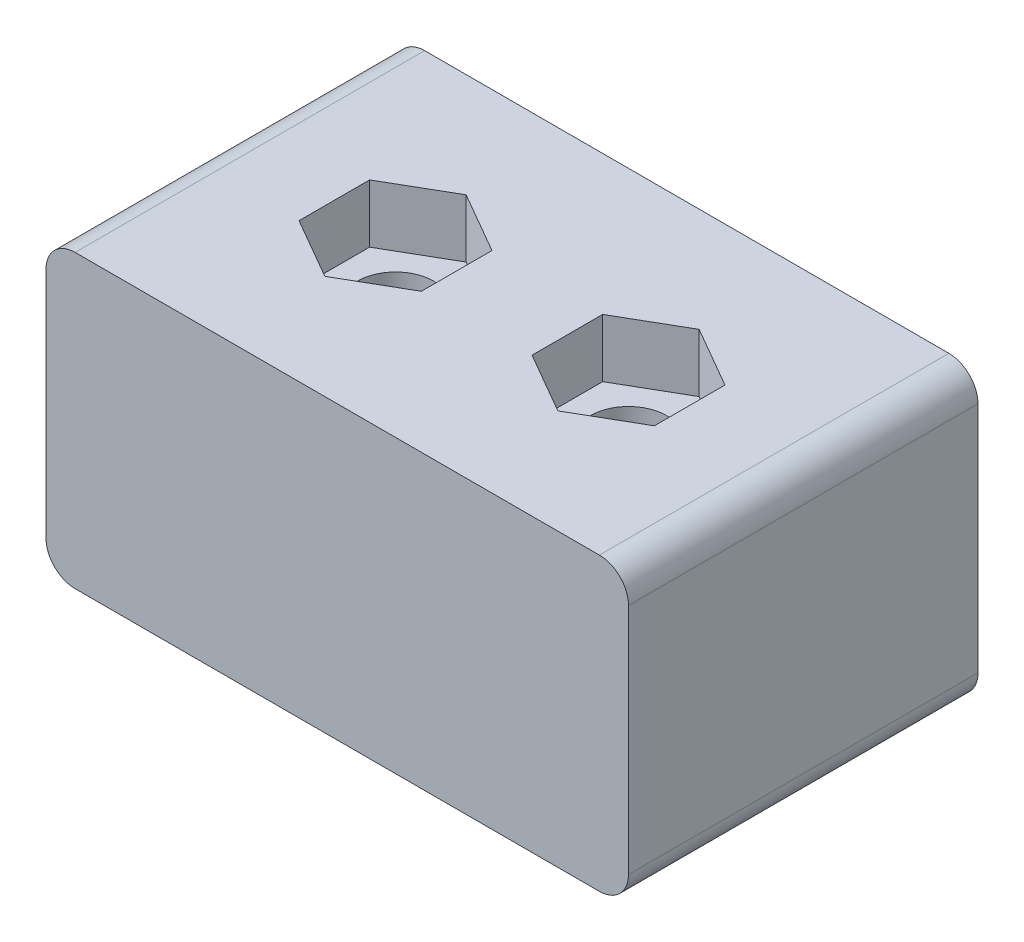
ISO-10303-21;
HEADER;
FILE_DESCRIPTION(('STEP AP214'),'2;1');
FILE_NAME('part.step','',(''),(''),'','','');
FILE_SCHEMA(('AUTOMOTIVE_DESIGN { 1 0 10303 214 1 1 1 1 }'));
ENDSEC;
DATA;
#1=APPLICATION_CONTEXT('core data for automotive mechanical design processes');
#2=APPLICATION_PROTOCOL_DEFINITION('international standard','automotive_design',2000,#1);
#3=PRODUCT_CONTEXT('',#1,'mechanical');
#4=PRODUCT('Part','Part','',(#3));
#5=PRODUCT_RELATED_PRODUCT_CATEGORY('part','',(#4));
#6=PRODUCT_DEFINITION_FORMATION('','',#4);
#7=PRODUCT_DEFINITION_CONTEXT('part definition',#1,'design');
#8=PRODUCT_DEFINITION('design','',#6,#7);
#9=PRODUCT_DEFINITION_SHAPE('','',#8);
#10=(LENGTH_UNIT() NAMED_UNIT(*) SI_UNIT(.MILLI.,.METRE.));
#11=(NAMED_UNIT(*) PLANE_ANGLE_UNIT() SI_UNIT($,.RADIAN.));
#12=(NAMED_UNIT(*) SI_UNIT($,.STERADIAN.) SOLID_ANGLE_UNIT());
#13=UNCERTAINTY_MEASURE_WITH_UNIT(LENGTH_MEASURE(1.E-05),#10,'distance_accuracy_value','');
#14=(GEOMETRIC_REPRESENTATION_CONTEXT(3) GLOBAL_UNCERTAINTY_ASSIGNED_CONTEXT((#13)) GLOBAL_UNIT_ASSIGNED_CONTEXT((#10,
#11,#12)) REPRESENTATION_CONTEXT('',''));
#15=CARTESIAN_POINT('',(0.,0.,0.));
#16=DIRECTION('',(0.,0.,1.));
#17=DIRECTION('',(1.,0.,0.));
#18=AXIS2_PLACEMENT_3D('',#15,#16,#17);
#19=CARTESIAN_POINT('',(-9.,1.,6.));
#20=DIRECTION('',(0.,0.,-1.));
#21=DIRECTION('',(-1.,0.,0.));
#22=AXIS2_PLACEMENT_3D('',#19,#20,#21);
#23=CYLINDRICAL_SURFACE('',#22,1.);
#24=CARTESIAN_POINT('',(-9.,1.,-6.));
#25=DIRECTION('',(0.,0.,1.));
#26=DIRECTION('',(1.,0.,0.));
#27=AXIS2_PLACEMENT_3D('',#24,#25,#26);
#28=CIRCLE('',#27,1.);
#29=CARTESIAN_POINT('',(-10.,1.,-6.));
#30=VERTEX_POINT('',#29);
#31=CARTESIAN_POINT('',(-9.,0.,-6.));
#32=VERTEX_POINT('',#31);
#33=EDGE_CURVE('E281',#30,#32,#28,.T.);
#34=ORIENTED_EDGE('',*,*,#33,.T.);
#35=DIRECTION('',(0.,0.,-1.));
#36=VECTOR('',#35,1.);
#37=CARTESIAN_POINT('',(-9.,0.,6.));
#38=LINE('',#37,#36);
#39=CARTESIAN_POINT('',(-9.,0.,6.));
#40=VERTEX_POINT('',#39);
#41=EDGE_CURVE('E11',#40,#32,#38,.T.);
#42=ORIENTED_EDGE('',*,*,#41,.F.);
#43=CARTESIAN_POINT('',(-9.,1.,6.));
#44=DIRECTION('',(0.,0.,1.));
#45=DIRECTION('',(1.,0.,0.));
#46=AXIS2_PLACEMENT_3D('',#43,#44,#45);
#47=CIRCLE('',#46,1.);
#48=CARTESIAN_POINT('',(-10.,1.,6.));
#49=VERTEX_POINT('',#48);
#50=EDGE_CURVE('E285',#49,#40,#47,.T.);
#51=ORIENTED_EDGE('',*,*,#50,.F.);
#52=DIRECTION('',(0.,0.,-1.));
#53=VECTOR('',#52,1.);
#54=CARTESIAN_POINT('',(-10.,1.,6.));
#55=LINE('',#54,#53);
#56=EDGE_CURVE('E303',#49,#30,#55,.T.);
#57=ORIENTED_EDGE('',*,*,#56,.T.);
#58=EDGE_LOOP('',(#34,#42,#51,#57));
#59=FACE_BOUND('',#58,.T.);
#60=ADVANCED_FACE('F39',(#59),#23,.T.);
#61=CARTESIAN_POINT('',(-9.,0.,6.));
#62=DIRECTION('',(0.,1.,0.));
#63=DIRECTION('',(0.,0.,1.));
#64=AXIS2_PLACEMENT_3D('',#61,#62,#63);
#65=PLANE('',#64);
#66=CARTESIAN_POINT('',(4.,0.,0.));
#67=DIRECTION('',(0.,1.,0.));
#68=DIRECTION('',(0.,0.,1.));
#69=AXIS2_PLACEMENT_3D('',#66,#67,#68);
#70=CIRCLE('',#69,1.3);
#71=CARTESIAN_POINT('',(4.,0.,1.3));
#72=VERTEX_POINT('',#71);
#73=EDGE_CURVE('E278',#72,#72,#70,.T.);
#74=ORIENTED_EDGE('',*,*,#73,.T.);
#75=EDGE_LOOP('',(#74));
#76=FACE_BOUND('',#75,.T.);
#77=CARTESIAN_POINT('',(-4.,0.,0.));
#78=DIRECTION('',(0.,1.,0.));
#79=DIRECTION('',(0.,0.,1.));
#80=AXIS2_PLACEMENT_3D('',#77,#78,#79);
#81=CIRCLE('',#80,1.3);
#82=CARTESIAN_POINT('',(-4.,0.,1.3));
#83=VERTEX_POINT('',#82);
#84=EDGE_CURVE('E282',#83,#83,#81,.T.);
#85=ORIENTED_EDGE('',*,*,#84,.T.);
#86=EDGE_LOOP('',(#85));
#87=FACE_BOUND('',#86,.T.);
#88=DIRECTION('',(1.,0.,0.));
#89=VECTOR('',#88,1.);
#90=CARTESIAN_POINT('',(-9.,0.,-6.));
#91=LINE('',#90,#89);
#92=CARTESIAN_POINT('',(9.,0.,-6.));
#93=VERTEX_POINT('',#92);
#94=EDGE_CURVE('E306',#32,#93,#91,.T.);
#95=ORIENTED_EDGE('',*,*,#94,.T.);
#96=DIRECTION('',(0.,0.,-1.));
#97=VECTOR('',#96,1.);
#98=CARTESIAN_POINT('',(9.,0.,6.));
#99=LINE('',#98,#97);
#100=CARTESIAN_POINT('',(9.,0.,6.));
#101=VERTEX_POINT('',#100);
#102=EDGE_CURVE('E47',#101,#93,#99,.T.);
#103=ORIENTED_EDGE('',*,*,#102,.F.);
#104=DIRECTION('',(1.,0.,0.));
#105=VECTOR('',#104,1.);
#106=CARTESIAN_POINT('',(-9.,0.,6.));
#107=LINE('',#106,#105);
#108=EDGE_CURVE('E288',#40,#101,#107,.T.);
#109=ORIENTED_EDGE('',*,*,#108,.F.);
#110=ORIENTED_EDGE('',*,*,#41,.T.);
#111=EDGE_LOOP('',(#95,#103,#109,#110));
#112=FACE_BOUND('',#111,.T.);
#113=ADVANCED_FACE('F354',(#76,#87,#112),#65,.F.);
#114=CARTESIAN_POINT('',(9.,1.,6.));
#115=DIRECTION('',(0.,0.,-1.));
#116=DIRECTION('',(-1.,0.,0.));
#117=AXIS2_PLACEMENT_3D('',#114,#115,#116);
#118=CYLINDRICAL_SURFACE('',#117,1.);
#119=CARTESIAN_POINT('',(9.,1.,-6.));
#120=DIRECTION('',(0.,0.,1.));
#121=DIRECTION('',(1.,0.,0.));
#122=AXIS2_PLACEMENT_3D('',#119,#120,#121);
#123=CIRCLE('',#122,1.);
#124=CARTESIAN_POINT('',(10.,1.,-6.));
#125=VERTEX_POINT('',#124);
#126=EDGE_CURVE('E308',#93,#125,#123,.T.);
#127=ORIENTED_EDGE('',*,*,#126,.T.);
#128=DIRECTION('',(0.,0.,-1.));
#129=VECTOR('',#128,1.);
#130=CARTESIAN_POINT('',(10.,1.,6.));
#131=LINE('',#130,#129);
#132=CARTESIAN_POINT('',(10.,1.,6.));
#133=VERTEX_POINT('',#132);
#134=EDGE_CURVE('E333',#133,#125,#131,.T.);
#135=ORIENTED_EDGE('',*,*,#134,.F.);
#136=CARTESIAN_POINT('',(9.,1.,6.));
#137=DIRECTION('',(0.,0.,1.));
#138=DIRECTION('',(1.,0.,0.));
#139=AXIS2_PLACEMENT_3D('',#136,#137,#138);
#140=CIRCLE('',#139,1.);
#141=EDGE_CURVE('E291',#101,#133,#140,.T.);
#142=ORIENTED_EDGE('',*,*,#141,.F.);
#143=ORIENTED_EDGE('',*,*,#102,.T.);
#144=EDGE_LOOP('',(#127,#135,#142,#143));
#145=FACE_BOUND('',#144,.T.);
#146=ADVANCED_FACE('F357',(#145),#118,.T.);
#147=CARTESIAN_POINT('',(10.,1.,6.));
#148=DIRECTION('',(-1.,0.,0.));
#149=DIRECTION('',(0.,0.,1.));
#150=AXIS2_PLACEMENT_3D('',#147,#148,#149);
#151=PLANE('',#150);
#152=DIRECTION('',(0.,1.,0.));
#153=VECTOR('',#152,1.);
#154=CARTESIAN_POINT('',(10.,1.,-6.));
#155=LINE('',#154,#153);
#156=CARTESIAN_POINT('',(10.,9.,-6.));
#157=VERTEX_POINT('',#156);
#158=EDGE_CURVE('E310',#125,#157,#155,.T.);
#159=ORIENTED_EDGE('',*,*,#158,.T.);
#160=DIRECTION('',(0.,0.,-1.));
#161=VECTOR('',#160,1.);
#162=CARTESIAN_POINT('',(10.,9.,6.));
#163=LINE('',#162,#161);
#164=CARTESIAN_POINT('',(10.,9.,6.));
#165=VERTEX_POINT('',#164);
#166=EDGE_CURVE('E330',#165,#157,#163,.T.);
#167=ORIENTED_EDGE('',*,*,#166,.F.);
#168=DIRECTION('',(0.,1.,0.));
#169=VECTOR('',#168,1.);
#170=CARTESIAN_POINT('',(10.,1.,6.));
#171=LINE('',#170,#169);
#172=EDGE_CURVE('E293',#133,#165,#171,.T.);
#173=ORIENTED_EDGE('',*,*,#172,.F.);
#174=ORIENTED_EDGE('',*,*,#134,.T.);
#175=EDGE_LOOP('',(#159,#167,#173,#174));
#176=FACE_BOUND('',#175,.T.);
#177=ADVANCED_FACE('F372',(#176),#151,.F.);
#178=CARTESIAN_POINT('',(9.,9.,6.));
#179=DIRECTION('',(0.,0.,-1.));
#180=DIRECTION('',(-1.,0.,0.));
#181=AXIS2_PLACEMENT_3D('',#178,#179,#180);
#182=CYLINDRICAL_SURFACE('',#181,0.999999999999999);
#183=CARTESIAN_POINT('',(9.,9.,-6.));
#184=DIRECTION('',(0.,0.,1.));
#185=DIRECTION('',(1.,0.,0.));
#186=AXIS2_PLACEMENT_3D('',#183,#184,#185);
#187=CIRCLE('',#186,0.999999999999999);
#188=CARTESIAN_POINT('',(9.,10.,-6.));
#189=VERTEX_POINT('',#188);
#190=EDGE_CURVE('E312',#157,#189,#187,.T.);
#191=ORIENTED_EDGE('',*,*,#190,.T.);
#192=DIRECTION('',(0.,0.,-1.));
#193=VECTOR('',#192,1.);
#194=CARTESIAN_POINT('',(9.,10.,6.));
#195=LINE('',#194,#193);
#196=CARTESIAN_POINT('',(9.,10.,6.));
#197=VERTEX_POINT('',#196);
#198=EDGE_CURVE('E327',#197,#189,#195,.T.);
#199=ORIENTED_EDGE('',*,*,#198,.F.);
#200=CARTESIAN_POINT('',(9.,9.,6.));
#201=DIRECTION('',(0.,0.,1.));
#202=DIRECTION('',(1.,0.,0.));
#203=AXIS2_PLACEMENT_3D('',#200,#201,#202);
#204=CIRCLE('',#203,0.999999999999999);
#205=EDGE_CURVE('E295',#165,#197,#204,.T.);
#206=ORIENTED_EDGE('',*,*,#205,.F.);
#207=ORIENTED_EDGE('',*,*,#166,.T.);
#208=EDGE_LOOP('',(#191,#199,#206,#207));
#209=FACE_BOUND('',#208,.T.);
#210=ADVANCED_FACE('F376',(#209),#182,.T.);
#211=CARTESIAN_POINT('',(9.,10.,6.));
#212=DIRECTION('',(0.,-1.,0.));
#213=DIRECTION('',(0.,0.,-1.));
#214=AXIS2_PLACEMENT_3D('',#211,#212,#213);
#215=PLANE('',#214);
#216=DIRECTION('',(-0.866025403784439,0.,-0.5));
#217=VECTOR('',#216,1.);
#218=CARTESIAN_POINT('',(4.,10.,-2.42487113059643));
#219=LINE('',#218,#217);
#220=CARTESIAN_POINT('',(6.1,10.,-1.21243556529821));
#221=VERTEX_POINT('',#220);
#222=CARTESIAN_POINT('',(4.,10.,-2.42487113059643));
#223=VERTEX_POINT('',#222);
#224=EDGE_CURVE('E212',#221,#223,#219,.T.);
#225=ORIENTED_EDGE('',*,*,#224,.F.);
#226=DIRECTION('',(0.,0.,-1.));
#227=VECTOR('',#226,1.);
#228=CARTESIAN_POINT('',(6.1,10.,-1.21243556529821));
#229=LINE('',#228,#227);
#230=CARTESIAN_POINT('',(6.1,10.,1.21243556529821));
#231=VERTEX_POINT('',#230);
#232=EDGE_CURVE('E55',#231,#221,#229,.T.);
#233=ORIENTED_EDGE('',*,*,#232,.F.);
#234=DIRECTION('',(0.866025403784439,0.,-0.5));
#235=VECTOR('',#234,1.);
#236=CARTESIAN_POINT('',(6.1,10.,1.21243556529821));
#237=LINE('',#236,#235);
#238=CARTESIAN_POINT('',(4.,10.,2.42487113059643));
#239=VERTEX_POINT('',#238);
#240=EDGE_CURVE('E198',#239,#231,#237,.T.);
#241=ORIENTED_EDGE('',*,*,#240,.F.);
#242=DIRECTION('',(0.866025403784439,0.,0.5));
#243=VECTOR('',#242,1.);
#244=CARTESIAN_POINT('',(4.,10.,2.42487113059643));
#245=LINE('',#244,#243);
#246=CARTESIAN_POINT('',(1.9,10.,1.21243556529821));
#247=VERTEX_POINT('',#246);
#248=EDGE_CURVE('E201',#247,#239,#245,.T.);
#249=ORIENTED_EDGE('',*,*,#248,.F.);
#250=DIRECTION('',(0.,0.,1.));
#251=VECTOR('',#250,1.);
#252=CARTESIAN_POINT('',(1.9,10.,1.21243556529821));
#253=LINE('',#252,#251);
#254=CARTESIAN_POINT('',(1.9,10.,-1.21243556529821));
#255=VERTEX_POINT('',#254);
#256=EDGE_CURVE('E217',#255,#247,#253,.T.);
#257=ORIENTED_EDGE('',*,*,#256,.F.);
#258=DIRECTION('',(-0.866025403784438,0.,0.5));
#259=VECTOR('',#258,1.);
#260=CARTESIAN_POINT('',(1.9,10.,-1.21243556529821));
#261=LINE('',#260,#259);
#262=EDGE_CURVE('E214',#223,#255,#261,.T.);
#263=ORIENTED_EDGE('',*,*,#262,.F.);
#264=EDGE_LOOP('',(#225,#233,#241,#249,#257,#263));
#265=FACE_BOUND('',#264,.T.);
#266=DIRECTION('',(-0.866025403784439,0.,-0.5));
#267=VECTOR('',#266,1.);
#268=CARTESIAN_POINT('',(-4.,10.,-2.42487113059643));
#269=LINE('',#268,#267);
#270=CARTESIAN_POINT('',(-1.9,10.,-1.21243556529821));
#271=VERTEX_POINT('',#270);
#272=CARTESIAN_POINT('',(-4.,10.,-2.42487113059643));
#273=VERTEX_POINT('',#272);
#274=EDGE_CURVE('E258',#271,#273,#269,.T.);
#275=ORIENTED_EDGE('',*,*,#274,.F.);
#276=DIRECTION('',(0.,0.,-1.));
#277=VECTOR('',#276,1.);
#278=CARTESIAN_POINT('',(-1.9,10.,-1.21243556529821));
#279=LINE('',#278,#277);
#280=CARTESIAN_POINT('',(-1.9,10.,1.21243556529821));
#281=VERTEX_POINT('',#280);
#282=EDGE_CURVE('E63',#281,#271,#279,.T.);
#283=ORIENTED_EDGE('',*,*,#282,.F.);
#284=DIRECTION('',(0.866025403784439,0.,-0.5));
#285=VECTOR('',#284,1.);
#286=CARTESIAN_POINT('',(-1.9,10.,1.21243556529821));
#287=LINE('',#286,#285);
#288=CARTESIAN_POINT('',(-4.,10.,2.42487113059643));
#289=VERTEX_POINT('',#288);
#290=EDGE_CURVE('E245',#289,#281,#287,.T.);
#291=ORIENTED_EDGE('',*,*,#290,.F.);
#292=DIRECTION('',(0.866025403784439,0.,0.5));
#293=VECTOR('',#292,1.);
#294=CARTESIAN_POINT('',(-4.,10.,2.42487113059643));
#295=LINE('',#294,#293);
#296=CARTESIAN_POINT('',(-6.1,10.,1.21243556529821));
#297=VERTEX_POINT('',#296);
#298=EDGE_CURVE('E248',#297,#289,#295,.T.);
#299=ORIENTED_EDGE('',*,*,#298,.F.);
#300=DIRECTION('',(0.,0.,1.));
#301=VECTOR('',#300,1.);
#302=CARTESIAN_POINT('',(-6.1,10.,1.21243556529821));
#303=LINE('',#302,#301);
#304=CARTESIAN_POINT('',(-6.1,10.,-1.21243556529821));
#305=VERTEX_POINT('',#304);
#306=EDGE_CURVE('E252',#305,#297,#303,.T.);
#307=ORIENTED_EDGE('',*,*,#306,.F.);
#308=DIRECTION('',(-0.866025403784438,0.,0.5));
#309=VECTOR('',#308,1.);
#310=CARTESIAN_POINT('',(-6.1,10.,-1.21243556529821));
#311=LINE('',#310,#309);
#312=EDGE_CURVE('E255',#273,#305,#311,.T.);
#313=ORIENTED_EDGE('',*,*,#312,.F.);
#314=EDGE_LOOP('',(#275,#283,#291,#299,#307,#313));
#315=FACE_BOUND('',#314,.T.);
#316=DIRECTION('',(-1.,0.,0.));
#317=VECTOR('',#316,1.);
#318=CARTESIAN_POINT('',(9.,10.,-6.));
#319=LINE('',#318,#317);
#320=CARTESIAN_POINT('',(-9.,10.,-6.));
#321=VERTEX_POINT('',#320);
#322=EDGE_CURVE('E314',#189,#321,#319,.T.);
#323=ORIENTED_EDGE('',*,*,#322,.T.);
#324=DIRECTION('',(0.,0.,-1.));
#325=VECTOR('',#324,1.);
#326=CARTESIAN_POINT('',(-9.,10.,6.));
#327=LINE('',#326,#325);
#328=CARTESIAN_POINT('',(-9.,10.,6.));
#329=VERTEX_POINT('',#328);
#330=EDGE_CURVE('E324',#329,#321,#327,.T.);
#331=ORIENTED_EDGE('',*,*,#330,.F.);
#332=DIRECTION('',(-1.,0.,0.));
#333=VECTOR('',#332,1.);
#334=CARTESIAN_POINT('',(9.,10.,6.));
#335=LINE('',#334,#333);
#336=EDGE_CURVE('E297',#197,#329,#335,.T.);
#337=ORIENTED_EDGE('',*,*,#336,.F.);
#338=ORIENTED_EDGE('',*,*,#198,.T.);
#339=EDGE_LOOP('',(#323,#331,#337,#338));
#340=FACE_BOUND('',#339,.T.);
#341=ADVANCED_FACE('F395',(#265,#315,#340),#215,.F.);
#342=CARTESIAN_POINT('',(-9.,9.,6.));
#343=DIRECTION('',(0.,0.,-1.));
#344=DIRECTION('',(-1.,0.,0.));
#345=AXIS2_PLACEMENT_3D('',#342,#343,#344);
#346=CYLINDRICAL_SURFACE('',#345,0.999999999999999);
#347=CARTESIAN_POINT('',(-9.,9.,-6.));
#348=DIRECTION('',(0.,0.,1.));
#349=DIRECTION('',(1.,0.,0.));
#350=AXIS2_PLACEMENT_3D('',#347,#348,#349);
#351=CIRCLE('',#350,0.999999999999999);
#352=CARTESIAN_POINT('',(-10.,9.,-6.));
#353=VERTEX_POINT('',#352);
#354=EDGE_CURVE('E316',#321,#353,#351,.T.);
#355=ORIENTED_EDGE('',*,*,#354,.T.);
#356=DIRECTION('',(0.,0.,-1.));
#357=VECTOR('',#356,1.);
#358=CARTESIAN_POINT('',(-10.,9.,6.));
#359=LINE('',#358,#357);
#360=CARTESIAN_POINT('',(-10.,9.,6.));
#361=VERTEX_POINT('',#360);
#362=EDGE_CURVE('E321',#361,#353,#359,.T.);
#363=ORIENTED_EDGE('',*,*,#362,.F.);
#364=CARTESIAN_POINT('',(-9.,9.,6.));
#365=DIRECTION('',(0.,0.,1.));
#366=DIRECTION('',(1.,0.,0.));
#367=AXIS2_PLACEMENT_3D('',#364,#365,#366);
#368=CIRCLE('',#367,0.999999999999999);
#369=EDGE_CURVE('E299',#329,#361,#368,.T.);
#370=ORIENTED_EDGE('',*,*,#369,.F.);
#371=ORIENTED_EDGE('',*,*,#330,.T.);
#372=EDGE_LOOP('',(#355,#363,#370,#371));
#373=FACE_BOUND('',#372,.T.);
#374=ADVANCED_FACE('F393',(#373),#346,.T.);
#375=CARTESIAN_POINT('',(-10.,9.,6.));
#376=DIRECTION('',(1.,0.,0.));
#377=DIRECTION('',(0.,0.,-1.));
#378=AXIS2_PLACEMENT_3D('',#375,#376,#377);
#379=PLANE('',#378);
#380=DIRECTION('',(0.,-1.,0.));
#381=VECTOR('',#380,1.);
#382=CARTESIAN_POINT('',(-10.,9.,-6.));
#383=LINE('',#382,#381);
#384=EDGE_CURVE('E289',#353,#30,#383,.T.);
#385=ORIENTED_EDGE('',*,*,#384,.T.);
#386=ORIENTED_EDGE('',*,*,#56,.F.);
#387=DIRECTION('',(0.,-1.,0.));
#388=VECTOR('',#387,1.);
#389=CARTESIAN_POINT('',(-10.,9.,6.));
#390=LINE('',#389,#388);
#391=EDGE_CURVE('E301',#361,#49,#390,.T.);
#392=ORIENTED_EDGE('',*,*,#391,.F.);
#393=ORIENTED_EDGE('',*,*,#362,.T.);
#394=EDGE_LOOP('',(#385,#386,#392,#393));
#395=FACE_BOUND('',#394,.T.);
#396=ADVANCED_FACE('F389',(#395),#379,.F.);
#397=CARTESIAN_POINT('',(-9.,1.,6.));
#398=DIRECTION('',(0.,0.,1.));
#399=DIRECTION('',(1.,0.,0.));
#400=AXIS2_PLACEMENT_3D('',#397,#398,#399);
#401=PLANE('',#400);
#402=ORIENTED_EDGE('',*,*,#50,.T.);
#403=ORIENTED_EDGE('',*,*,#108,.T.);
#404=ORIENTED_EDGE('',*,*,#141,.T.);
#405=ORIENTED_EDGE('',*,*,#172,.T.);
#406=ORIENTED_EDGE('',*,*,#205,.T.);
#407=ORIENTED_EDGE('',*,*,#336,.T.);
#408=ORIENTED_EDGE('',*,*,#369,.T.);
#409=ORIENTED_EDGE('',*,*,#391,.T.);
#410=EDGE_LOOP('',(#402,#403,#404,#405,#406,#407,#408,#409));
#411=FACE_BOUND('',#410,.T.);
#412=ADVANCED_FACE('F380',(#411),#401,.T.);
#413=CARTESIAN_POINT('',(-9.,1.,-6.));
#414=DIRECTION('',(0.,0.,1.));
#415=DIRECTION('',(1.,0.,0.));
#416=AXIS2_PLACEMENT_3D('',#413,#414,#415);
#417=PLANE('',#416);
#418=ORIENTED_EDGE('',*,*,#33,.F.);
#419=ORIENTED_EDGE('',*,*,#384,.F.);
#420=ORIENTED_EDGE('',*,*,#354,.F.);
#421=ORIENTED_EDGE('',*,*,#322,.F.);
#422=ORIENTED_EDGE('',*,*,#190,.F.);
#423=ORIENTED_EDGE('',*,*,#158,.F.);
#424=ORIENTED_EDGE('',*,*,#126,.F.);
#425=ORIENTED_EDGE('',*,*,#94,.F.);
#426=EDGE_LOOP('',(#418,#419,#420,#421,#422,#423,#424,#425));
#427=FACE_BOUND('',#426,.T.);
#428=ADVANCED_FACE('F350',(#427),#417,.F.);
#429=CARTESIAN_POINT('',(-4.,10.,0.));
#430=DIRECTION('',(0.,-1.,0.));
#431=DIRECTION('',(0.,0.,-1.));
#432=AXIS2_PLACEMENT_3D('',#429,#430,#431);
#433=CYLINDRICAL_SURFACE('',#432,1.3);
#434=CARTESIAN_POINT('',(-4.,8.,0.));
#435=DIRECTION('',(0.,-1.,0.));
#436=DIRECTION('',(0.,0.,-1.));
#437=AXIS2_PLACEMENT_3D('',#434,#435,#436);
#438=CIRCLE('',#437,1.3);
#439=CARTESIAN_POINT('',(-4.,8.,-1.3));
#440=VERTEX_POINT('',#439);
#441=EDGE_CURVE('E42',#440,#440,#438,.T.);
#442=ORIENTED_EDGE('',*,*,#441,.F.);
#443=EDGE_LOOP('',(#442));
#444=FACE_BOUND('',#443,.T.);
#445=ORIENTED_EDGE('',*,*,#84,.F.);
#446=EDGE_LOOP('',(#445));
#447=FACE_BOUND('',#446,.T.);
#448=ADVANCED_FACE('F346',(#444,#447),#433,.F.);
#449=CARTESIAN_POINT('',(4.,10.,0.));
#450=DIRECTION('',(0.,-1.,0.));
#451=DIRECTION('',(0.,0.,-1.));
#452=AXIS2_PLACEMENT_3D('',#449,#450,#451);
#453=CYLINDRICAL_SURFACE('',#452,1.3);
#454=CARTESIAN_POINT('',(4.,8.,0.));
#455=DIRECTION('',(0.,-1.,0.));
#456=DIRECTION('',(0.,0.,-1.));
#457=AXIS2_PLACEMENT_3D('',#454,#455,#456);
#458=CIRCLE('',#457,1.3);
#459=CARTESIAN_POINT('',(4.,8.,-1.3));
#460=VERTEX_POINT('',#459);
#461=EDGE_CURVE('E224',#460,#460,#458,.T.);
#462=ORIENTED_EDGE('',*,*,#461,.F.);
#463=EDGE_LOOP('',(#462));
#464=FACE_BOUND('',#463,.T.);
#465=ORIENTED_EDGE('',*,*,#73,.F.);
#466=EDGE_LOOP('',(#465));
#467=FACE_BOUND('',#466,.T.);
#468=ADVANCED_FACE('F349',(#464,#467),#453,.F.);
#469=CARTESIAN_POINT('',(6.1,8.,-1.21243556529821));
#470=DIRECTION('',(1.,0.,0.));
#471=DIRECTION('',(0.,0.,-1.));
#472=AXIS2_PLACEMENT_3D('',#469,#470,#471);
#473=PLANE('',#472);
#474=ORIENTED_EDGE('',*,*,#232,.T.);
#475=DIRECTION('',(0.,1.,0.));
#476=VECTOR('',#475,1.);
#477=CARTESIAN_POINT('',(6.1,8.,-1.21243556529821));
#478=LINE('',#477,#476);
#479=CARTESIAN_POINT('',(6.1,8.,-1.21243556529821));
#480=VERTEX_POINT('',#479);
#481=EDGE_CURVE('E175',#480,#221,#478,.T.);
#482=ORIENTED_EDGE('',*,*,#481,.F.);
#483=DIRECTION('',(0.,0.,-1.));
#484=VECTOR('',#483,1.);
#485=CARTESIAN_POINT('',(6.1,8.,-1.21243556529821));
#486=LINE('',#485,#484);
#487=CARTESIAN_POINT('',(6.1,8.,1.21243556529821));
#488=VERTEX_POINT('',#487);
#489=EDGE_CURVE('E179',#488,#480,#486,.T.);
#490=ORIENTED_EDGE('',*,*,#489,.F.);
#491=DIRECTION('',(0.,1.,0.));
#492=VECTOR('',#491,1.);
#493=CARTESIAN_POINT('',(6.1,8.,1.21243556529821));
#494=LINE('',#493,#492);
#495=EDGE_CURVE('E222',#488,#231,#494,.T.);
#496=ORIENTED_EDGE('',*,*,#495,.T.);
#497=EDGE_LOOP('',(#474,#482,#490,#496));
#498=FACE_BOUND('',#497,.T.);
#499=ADVANCED_FACE('F177',(#498),#473,.F.);
#500=CARTESIAN_POINT('',(6.1,8.,1.21243556529821));
#501=DIRECTION('',(0.5,0.,0.866025403784438));
#502=DIRECTION('',(0.866025403784439,0.,-0.5));
#503=AXIS2_PLACEMENT_3D('',#500,#501,#502);
#504=PLANE('',#503);
#505=ORIENTED_EDGE('',*,*,#240,.T.);
#506=ORIENTED_EDGE('',*,*,#495,.F.);
#507=DIRECTION('',(0.866025403784439,0.,-0.5));
#508=VECTOR('',#507,1.);
#509=CARTESIAN_POINT('',(6.1,8.,1.21243556529821));
#510=LINE('',#509,#508);
#511=CARTESIAN_POINT('',(4.,8.,2.42487113059643));
#512=VERTEX_POINT('',#511);
#513=EDGE_CURVE('E185',#512,#488,#510,.T.);
#514=ORIENTED_EDGE('',*,*,#513,.F.);
#515=DIRECTION('',(0.,1.,0.));
#516=VECTOR('',#515,1.);
#517=CARTESIAN_POINT('',(4.,8.,2.42487113059643));
#518=LINE('',#517,#516);
#519=EDGE_CURVE('E225',#512,#239,#518,.T.);
#520=ORIENTED_EDGE('',*,*,#519,.T.);
#521=EDGE_LOOP('',(#505,#506,#514,#520));
#522=FACE_BOUND('',#521,.T.);
#523=ADVANCED_FACE('F493',(#522),#504,.F.);
#524=CARTESIAN_POINT('',(4.,8.,2.42487113059643));
#525=DIRECTION('',(-0.5,0.,0.866025403784439));
#526=DIRECTION('',(0.866025403784439,0.,0.5));
#527=AXIS2_PLACEMENT_3D('',#524,#525,#526);
#528=PLANE('',#527);
#529=ORIENTED_EDGE('',*,*,#248,.T.);
#530=ORIENTED_EDGE('',*,*,#519,.F.);
#531=DIRECTION('',(0.866025403784439,0.,0.5));
#532=VECTOR('',#531,1.);
#533=CARTESIAN_POINT('',(4.,8.,2.42487113059643));
#534=LINE('',#533,#532);
#535=CARTESIAN_POINT('',(1.9,8.,1.21243556529821));
#536=VERTEX_POINT('',#535);
#537=EDGE_CURVE('E208',#536,#512,#534,.T.);
#538=ORIENTED_EDGE('',*,*,#537,.F.);
#539=DIRECTION('',(0.,1.,0.));
#540=VECTOR('',#539,1.);
#541=CARTESIAN_POINT('',(1.9,8.,1.21243556529821));
#542=LINE('',#541,#540);
#543=EDGE_CURVE('E227',#536,#247,#542,.T.);
#544=ORIENTED_EDGE('',*,*,#543,.T.);
#545=EDGE_LOOP('',(#529,#530,#538,#544));
#546=FACE_BOUND('',#545,.T.);
#547=ADVANCED_FACE('F501',(#546),#528,.F.);
#548=CARTESIAN_POINT('',(1.9,8.,1.21243556529821));
#549=DIRECTION('',(-1.,0.,0.));
#550=DIRECTION('',(0.,0.,1.));
#551=AXIS2_PLACEMENT_3D('',#548,#549,#550);
#552=PLANE('',#551);
#553=ORIENTED_EDGE('',*,*,#256,.T.);
#554=ORIENTED_EDGE('',*,*,#543,.F.);
#555=DIRECTION('',(0.,0.,1.));
#556=VECTOR('',#555,1.);
#557=CARTESIAN_POINT('',(1.9,8.,1.21243556529821));
#558=LINE('',#557,#556);
#559=CARTESIAN_POINT('',(1.9,8.,-1.21243556529821));
#560=VERTEX_POINT('',#559);
#561=EDGE_CURVE('E205',#560,#536,#558,.T.);
#562=ORIENTED_EDGE('',*,*,#561,.F.);
#563=DIRECTION('',(0.,1.,0.));
#564=VECTOR('',#563,1.);
#565=CARTESIAN_POINT('',(1.9,8.,-1.21243556529821));
#566=LINE('',#565,#564);
#567=EDGE_CURVE('E229',#560,#255,#566,.T.);
#568=ORIENTED_EDGE('',*,*,#567,.T.);
#569=EDGE_LOOP('',(#553,#554,#562,#568));
#570=FACE_BOUND('',#569,.T.);
#571=ADVANCED_FACE('F510',(#570),#552,.F.);
#572=CARTESIAN_POINT('',(1.9,8.,-1.21243556529821));
#573=DIRECTION('',(-0.5,0.,-0.866025403784439));
#574=DIRECTION('',(-0.866025403784439,0.,0.5));
#575=AXIS2_PLACEMENT_3D('',#572,#573,#574);
#576=PLANE('',#575);
#577=ORIENTED_EDGE('',*,*,#262,.T.);
#578=ORIENTED_EDGE('',*,*,#567,.F.);
#579=DIRECTION('',(-0.866025403784438,0.,0.5));
#580=VECTOR('',#579,1.);
#581=CARTESIAN_POINT('',(1.9,8.,-1.21243556529821));
#582=LINE('',#581,#580);
#583=CARTESIAN_POINT('',(4.,8.,-2.42487113059643));
#584=VERTEX_POINT('',#583);
#585=EDGE_CURVE('E193',#584,#560,#582,.T.);
#586=ORIENTED_EDGE('',*,*,#585,.F.);
#587=DIRECTION('',(0.,1.,0.));
#588=VECTOR('',#587,1.);
#589=CARTESIAN_POINT('',(4.,8.,-2.42487113059643));
#590=LINE('',#589,#588);
#591=EDGE_CURVE('E184',#584,#223,#590,.T.);
#592=ORIENTED_EDGE('',*,*,#591,.T.);
#593=EDGE_LOOP('',(#577,#578,#586,#592));
#594=FACE_BOUND('',#593,.T.);
#595=ADVANCED_FACE('F519',(#594),#576,.F.);
#596=CARTESIAN_POINT('',(4.,8.,-2.42487113059643));
#597=DIRECTION('',(0.5,0.,-0.866025403784439));
#598=DIRECTION('',(-0.866025403784439,0.,-0.5));
#599=AXIS2_PLACEMENT_3D('',#596,#597,#598);
#600=PLANE('',#599);
#601=ORIENTED_EDGE('',*,*,#224,.T.);
#602=ORIENTED_EDGE('',*,*,#591,.F.);
#603=DIRECTION('',(-0.866025403784439,0.,-0.5));
#604=VECTOR('',#603,1.);
#605=CARTESIAN_POINT('',(4.,8.,-2.42487113059643));
#606=LINE('',#605,#604);
#607=EDGE_CURVE('E188',#480,#584,#606,.T.);
#608=ORIENTED_EDGE('',*,*,#607,.F.);
#609=ORIENTED_EDGE('',*,*,#481,.T.);
#610=EDGE_LOOP('',(#601,#602,#608,#609));
#611=FACE_BOUND('',#610,.T.);
#612=ADVANCED_FACE('F189',(#611),#600,.F.);
#613=CARTESIAN_POINT('',(0.,8.,0.));
#614=DIRECTION('',(0.,-1.,0.));
#615=DIRECTION('',(0.,0.,-1.));
#616=AXIS2_PLACEMENT_3D('',#613,#614,#615);
#617=PLANE('',#616);
#618=ORIENTED_EDGE('',*,*,#461,.T.);
#619=EDGE_LOOP('',(#618));
#620=FACE_BOUND('',#619,.T.);
#621=ORIENTED_EDGE('',*,*,#489,.T.);
#622=ORIENTED_EDGE('',*,*,#607,.T.);
#623=ORIENTED_EDGE('',*,*,#585,.T.);
#624=ORIENTED_EDGE('',*,*,#561,.T.);
#625=ORIENTED_EDGE('',*,*,#537,.T.);
#626=ORIENTED_EDGE('',*,*,#513,.T.);
#627=EDGE_LOOP('',(#621,#622,#623,#624,#625,#626));
#628=FACE_BOUND('',#627,.T.);
#629=ADVANCED_FACE('F195',(#620,#628),#617,.F.);
#630=CARTESIAN_POINT('',(-1.9,8.,-1.21243556529821));
#631=DIRECTION('',(1.,0.,0.));
#632=DIRECTION('',(0.,0.,-1.));
#633=AXIS2_PLACEMENT_3D('',#630,#631,#632);
#634=PLANE('',#633);
#635=ORIENTED_EDGE('',*,*,#282,.T.);
#636=DIRECTION('',(0.,1.,0.));
#637=VECTOR('',#636,1.);
#638=CARTESIAN_POINT('',(-1.9,8.,-1.21243556529821));
#639=LINE('',#638,#637);
#640=CARTESIAN_POINT('',(-1.9,8.,-1.21243556529821));
#641=VERTEX_POINT('',#640);
#642=EDGE_CURVE('E232',#641,#271,#639,.T.);
#643=ORIENTED_EDGE('',*,*,#642,.F.);
#644=DIRECTION('',(0.,0.,-1.));
#645=VECTOR('',#644,1.);
#646=CARTESIAN_POINT('',(-1.9,8.,-1.21243556529821));
#647=LINE('',#646,#645);
#648=CARTESIAN_POINT('',(-1.9,8.,1.21243556529821));
#649=VERTEX_POINT('',#648);
#650=EDGE_CURVE('E249',#649,#641,#647,.T.);
#651=ORIENTED_EDGE('',*,*,#650,.F.);
#652=DIRECTION('',(0.,1.,0.));
#653=VECTOR('',#652,1.);
#654=CARTESIAN_POINT('',(-1.9,8.,1.21243556529821));
#655=LINE('',#654,#653);
#656=EDGE_CURVE('E243',#649,#281,#655,.T.);
#657=ORIENTED_EDGE('',*,*,#656,.T.);
#658=EDGE_LOOP('',(#635,#643,#651,#657));
#659=FACE_BOUND('',#658,.T.);
#660=ADVANCED_FACE('F543',(#659),#634,.F.);
#661=CARTESIAN_POINT('',(-1.9,8.,1.21243556529821));
#662=DIRECTION('',(0.5,0.,0.866025403784439));
#663=DIRECTION('',(0.866025403784439,0.,-0.5));
#664=AXIS2_PLACEMENT_3D('',#661,#662,#663);
#665=PLANE('',#664);
#666=ORIENTED_EDGE('',*,*,#290,.T.);
#667=ORIENTED_EDGE('',*,*,#656,.F.);
#668=DIRECTION('',(0.866025403784439,0.,-0.5));
#669=VECTOR('',#668,1.);
#670=CARTESIAN_POINT('',(-1.9,8.,1.21243556529821));
#671=LINE('',#670,#669);
#672=CARTESIAN_POINT('',(-4.,8.,2.42487113059643));
#673=VERTEX_POINT('',#672);
#674=EDGE_CURVE('E234',#673,#649,#671,.T.);
#675=ORIENTED_EDGE('',*,*,#674,.F.);
#676=DIRECTION('',(0.,1.,0.));
#677=VECTOR('',#676,1.);
#678=CARTESIAN_POINT('',(-4.,8.,2.42487113059643));
#679=LINE('',#678,#677);
#680=EDGE_CURVE('E241',#673,#289,#679,.T.);
#681=ORIENTED_EDGE('',*,*,#680,.T.);
#682=EDGE_LOOP('',(#666,#667,#675,#681));
#683=FACE_BOUND('',#682,.T.);
#684=ADVANCED_FACE('F551',(#683),#665,.F.);
#685=CARTESIAN_POINT('',(-4.,8.,2.42487113059643));
#686=DIRECTION('',(-0.5,0.,0.866025403784439));
#687=DIRECTION('',(0.866025403784439,0.,0.5));
#688=AXIS2_PLACEMENT_3D('',#685,#686,#687);
#689=PLANE('',#688);
#690=ORIENTED_EDGE('',*,*,#298,.T.);
#691=ORIENTED_EDGE('',*,*,#680,.F.);
#692=DIRECTION('',(0.866025403784439,0.,0.5));
#693=VECTOR('',#692,1.);
#694=CARTESIAN_POINT('',(-4.,8.,2.42487113059643));
#695=LINE('',#694,#693);
#696=CARTESIAN_POINT('',(-6.1,8.,1.21243556529821));
#697=VERTEX_POINT('',#696);
#698=EDGE_CURVE('E264',#697,#673,#695,.T.);
#699=ORIENTED_EDGE('',*,*,#698,.F.);
#700=DIRECTION('',(0.,1.,0.));
#701=VECTOR('',#700,1.);
#702=CARTESIAN_POINT('',(-6.1,8.,1.21243556529821));
#703=LINE('',#702,#701);
#704=EDGE_CURVE('E239',#697,#297,#703,.T.);
#705=ORIENTED_EDGE('',*,*,#704,.T.);
#706=EDGE_LOOP('',(#690,#691,#699,#705));
#707=FACE_BOUND('',#706,.T.);
#708=ADVANCED_FACE('F559',(#707),#689,.F.);
#709=CARTESIAN_POINT('',(-6.1,8.,1.21243556529821));
#710=DIRECTION('',(-1.,0.,0.));
#711=DIRECTION('',(0.,0.,1.));
#712=AXIS2_PLACEMENT_3D('',#709,#710,#711);
#713=PLANE('',#712);
#714=ORIENTED_EDGE('',*,*,#306,.T.);
#715=ORIENTED_EDGE('',*,*,#704,.F.);
#716=DIRECTION('',(0.,0.,1.));
#717=VECTOR('',#716,1.);
#718=CARTESIAN_POINT('',(-6.1,8.,1.21243556529821));
#719=LINE('',#718,#717);
#720=CARTESIAN_POINT('',(-6.1,8.,-1.21243556529821));
#721=VERTEX_POINT('',#720);
#722=EDGE_CURVE('E267',#721,#697,#719,.T.);
#723=ORIENTED_EDGE('',*,*,#722,.F.);
#724=DIRECTION('',(0.,1.,0.));
#725=VECTOR('',#724,1.);
#726=CARTESIAN_POINT('',(-6.1,8.,-1.21243556529821));
#727=LINE('',#726,#725);
#728=EDGE_CURVE('E237',#721,#305,#727,.T.);
#729=ORIENTED_EDGE('',*,*,#728,.T.);
#730=EDGE_LOOP('',(#714,#715,#723,#729));
#731=FACE_BOUND('',#730,.T.);
#732=ADVANCED_FACE('F568',(#731),#713,.F.);
#733=CARTESIAN_POINT('',(-6.1,8.,-1.21243556529821));
#734=DIRECTION('',(-0.5,0.,-0.866025403784439));
#735=DIRECTION('',(-0.866025403784439,0.,0.5));
#736=AXIS2_PLACEMENT_3D('',#733,#734,#735);
#737=PLANE('',#736);
#738=ORIENTED_EDGE('',*,*,#312,.T.);
#739=ORIENTED_EDGE('',*,*,#728,.F.);
#740=DIRECTION('',(-0.866025403784438,0.,0.5));
#741=VECTOR('',#740,1.);
#742=CARTESIAN_POINT('',(-6.1,8.,-1.21243556529821));
#743=LINE('',#742,#741);
#744=CARTESIAN_POINT('',(-4.,8.,-2.42487113059643));
#745=VERTEX_POINT('',#744);
#746=EDGE_CURVE('E270',#745,#721,#743,.T.);
#747=ORIENTED_EDGE('',*,*,#746,.F.);
#748=DIRECTION('',(0.,1.,0.));
#749=VECTOR('',#748,1.);
#750=CARTESIAN_POINT('',(-4.,8.,-2.42487113059643));
#751=LINE('',#750,#749);
#752=EDGE_CURVE('E235',#745,#273,#751,.T.);
#753=ORIENTED_EDGE('',*,*,#752,.T.);
#754=EDGE_LOOP('',(#738,#739,#747,#753));
#755=FACE_BOUND('',#754,.T.);
#756=ADVANCED_FACE('F577',(#755),#737,.F.);
#757=CARTESIAN_POINT('',(-4.,8.,-2.42487113059643));
#758=DIRECTION('',(0.5,0.,-0.866025403784439));
#759=DIRECTION('',(-0.866025403784439,0.,-0.5));
#760=AXIS2_PLACEMENT_3D('',#757,#758,#759);
#761=PLANE('',#760);
#762=ORIENTED_EDGE('',*,*,#274,.T.);
#763=ORIENTED_EDGE('',*,*,#752,.F.);
#764=DIRECTION('',(-0.866025403784439,0.,-0.5));
#765=VECTOR('',#764,1.);
#766=CARTESIAN_POINT('',(-4.,8.,-2.42487113059643));
#767=LINE('',#766,#765);
#768=EDGE_CURVE('E273',#641,#745,#767,.T.);
#769=ORIENTED_EDGE('',*,*,#768,.F.);
#770=ORIENTED_EDGE('',*,*,#642,.T.);
#771=EDGE_LOOP('',(#762,#763,#769,#770));
#772=FACE_BOUND('',#771,.T.);
#773=ADVANCED_FACE('F586',(#772),#761,.F.);
#774=CARTESIAN_POINT('',(0.,8.,0.));
#775=DIRECTION('',(0.,-1.,0.));
#776=DIRECTION('',(0.,0.,-1.));
#777=AXIS2_PLACEMENT_3D('',#774,#775,#776);
#778=PLANE('',#777);
#779=ORIENTED_EDGE('',*,*,#441,.T.);
#780=EDGE_LOOP('',(#779));
#781=FACE_BOUND('',#780,.T.);
#782=ORIENTED_EDGE('',*,*,#650,.T.);
#783=ORIENTED_EDGE('',*,*,#768,.T.);
#784=ORIENTED_EDGE('',*,*,#746,.T.);
#785=ORIENTED_EDGE('',*,*,#722,.T.);
#786=ORIENTED_EDGE('',*,*,#698,.T.);
#787=ORIENTED_EDGE('',*,*,#674,.T.);
#788=EDGE_LOOP('',(#782,#783,#784,#785,#786,#787));
#789=FACE_BOUND('',#788,.T.);
#790=ADVANCED_FACE('F343',(#781,#789),#778,.F.);
#791=CLOSED_SHELL('',(#60,#113,#146,#177,#210,#341,#374,#396,#412,#428,#448,#468,#499,#523,#547,
#571,#595,#612,#629,#660,#684,#708,#732,#756,#773,#790));
#792=MANIFOLD_SOLID_BREP('B2',#791);
#793=ADVANCED_BREP_SHAPE_REPRESENTATION('',(#18,#792),#14);
#794=SHAPE_DEFINITION_REPRESENTATION(#9,#793);
ENDSEC;
END-ISO-10303-21;
